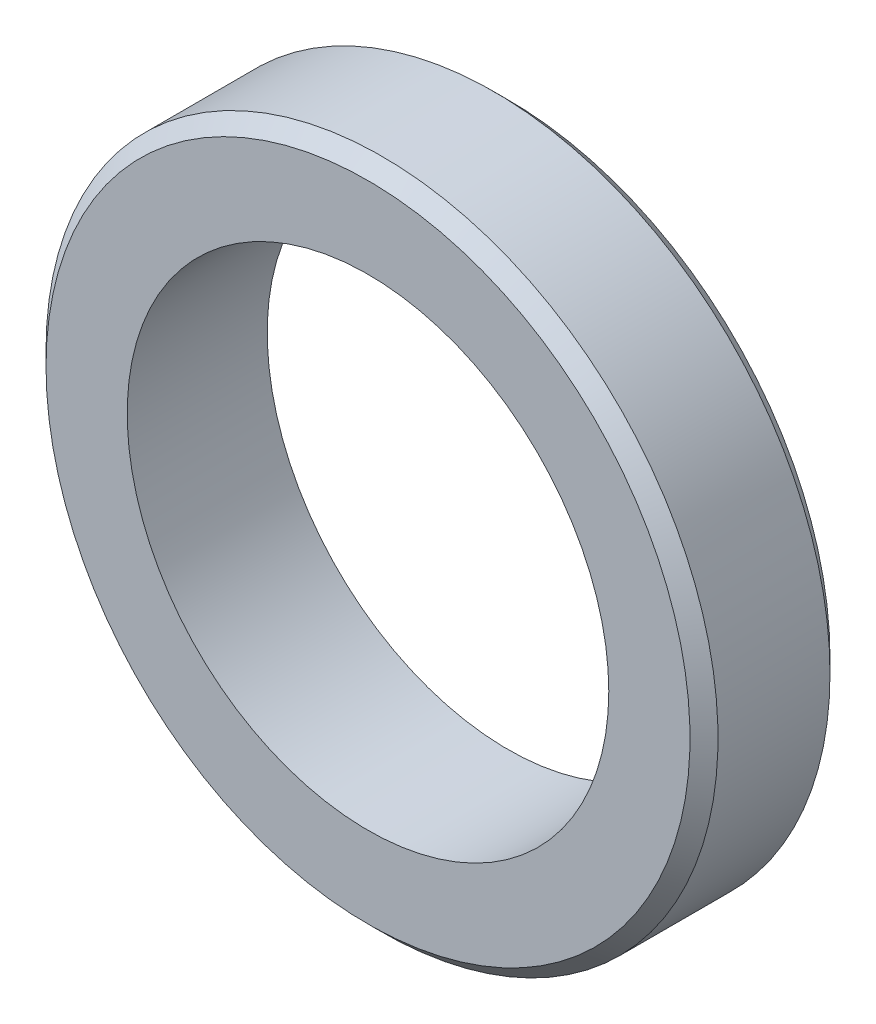
ISO-10303-21;
HEADER;
FILE_DESCRIPTION(('STEP AP214'),'2;1');
FILE_NAME('part.step','',(''),(''),'','','');
FILE_SCHEMA(('AUTOMOTIVE_DESIGN { 1 0 10303 214 1 1 1 1 }'));
ENDSEC;
DATA;
#1=APPLICATION_CONTEXT('core data for automotive mechanical design processes');
#2=APPLICATION_PROTOCOL_DEFINITION('international standard','automotive_design',2000,#1);
#3=PRODUCT_CONTEXT('',#1,'mechanical');
#4=PRODUCT('Part','Part','',(#3));
#5=PRODUCT_RELATED_PRODUCT_CATEGORY('part','',(#4));
#6=PRODUCT_DEFINITION_FORMATION('','',#4);
#7=PRODUCT_DEFINITION_CONTEXT('part definition',#1,'design');
#8=PRODUCT_DEFINITION('design','',#6,#7);
#9=PRODUCT_DEFINITION_SHAPE('','',#8);
#10=(LENGTH_UNIT() NAMED_UNIT(*) SI_UNIT(.MILLI.,.METRE.));
#11=(NAMED_UNIT(*) PLANE_ANGLE_UNIT() SI_UNIT($,.RADIAN.));
#12=(NAMED_UNIT(*) SI_UNIT($,.STERADIAN.) SOLID_ANGLE_UNIT());
#13=UNCERTAINTY_MEASURE_WITH_UNIT(LENGTH_MEASURE(1.E-05),#10,'distance_accuracy_value','');
#14=(GEOMETRIC_REPRESENTATION_CONTEXT(3) GLOBAL_UNCERTAINTY_ASSIGNED_CONTEXT((#13)) GLOBAL_UNIT_ASSIGNED_CONTEXT((#10,
#11,#12)) REPRESENTATION_CONTEXT('',''));
#15=CARTESIAN_POINT('',(0.,0.,0.));
#16=DIRECTION('',(0.,0.,1.));
#17=DIRECTION('',(1.,0.,0.));
#18=AXIS2_PLACEMENT_3D('',#15,#16,#17);
#19=CARTESIAN_POINT('',(0.,0.,5.));
#20=DIRECTION('',(0.,0.,-1.));
#21=DIRECTION('',(-1.,0.,0.));
#22=AXIS2_PLACEMENT_3D('',#19,#20,#21);
#23=CYLINDRICAL_SURFACE('',#22,12.);
#24=CARTESIAN_POINT('',(0.,0.,0.5));
#25=DIRECTION('',(0.,0.,1.));
#26=DIRECTION('',(1.,0.,0.));
#27=AXIS2_PLACEMENT_3D('',#24,#25,#26);
#28=CIRCLE('',#27,12.);
#29=CARTESIAN_POINT('',(-12.,0.,0.500000000000001));
#30=VERTEX_POINT('',#29);
#31=EDGE_CURVE('E52',#30,#30,#28,.T.);
#32=CARTESIAN_POINT('',(0.,0.,4.5));
#33=DIRECTION('',(0.,0.,1.));
#34=DIRECTION('',(1.,0.,0.));
#35=AXIS2_PLACEMENT_3D('',#32,#33,#34);
#36=CIRCLE('',#35,12.);
#37=CARTESIAN_POINT('',(-12.,0.,4.5));
#38=VERTEX_POINT('',#37);
#39=EDGE_CURVE('E56',#38,#38,#36,.F.);
#40=CARTESIAN_POINT('',(-12.,0.,0.500000000000001));
#41=CARTESIAN_POINT('',(-12.,0.,0.541666666666668));
#42=CARTESIAN_POINT('',(-12.,0.,0.583333333333335));
#43=CARTESIAN_POINT('',(-12.,0.,0.666666666666668));
#44=CARTESIAN_POINT('',(-12.,0.,0.708333333333335));
#45=CARTESIAN_POINT('',(-12.,0.,0.791666666666668));
#46=CARTESIAN_POINT('',(-12.,0.,0.833333333333334));
#47=CARTESIAN_POINT('',(-12.,0.,0.916666666666668));
#48=CARTESIAN_POINT('',(-12.,0.,0.958333333333334));
#49=CARTESIAN_POINT('',(-12.,0.,1.04166666666667));
#50=CARTESIAN_POINT('',(-12.,0.,1.08333333333333));
#51=CARTESIAN_POINT('',(-12.,0.,1.16666666666667));
#52=CARTESIAN_POINT('',(-12.,0.,1.20833333333333));
#53=CARTESIAN_POINT('',(-12.,0.,1.29166666666667));
#54=CARTESIAN_POINT('',(-12.,0.,1.33333333333333));
#55=CARTESIAN_POINT('',(-12.,0.,1.41666666666667));
#56=CARTESIAN_POINT('',(-12.,0.,1.45833333333333));
#57=CARTESIAN_POINT('',(-12.,0.,1.54166666666667));
#58=CARTESIAN_POINT('',(-12.,0.,1.58333333333333));
#59=CARTESIAN_POINT('',(-12.,0.,1.66666666666667));
#60=CARTESIAN_POINT('',(-12.,0.,1.70833333333333));
#61=CARTESIAN_POINT('',(-12.,0.,1.79166666666667));
#62=CARTESIAN_POINT('',(-12.,0.,1.83333333333333));
#63=CARTESIAN_POINT('',(-12.,0.,1.91666666666667));
#64=CARTESIAN_POINT('',(-12.,0.,1.95833333333333));
#65=CARTESIAN_POINT('',(-12.,0.,2.04166666666667));
#66=CARTESIAN_POINT('',(-12.,0.,2.08333333333333));
#67=CARTESIAN_POINT('',(-12.,0.,2.16666666666667));
#68=CARTESIAN_POINT('',(-12.,0.,2.20833333333333));
#69=CARTESIAN_POINT('',(-12.,0.,2.29166666666667));
#70=CARTESIAN_POINT('',(-12.,0.,2.33333333333333));
#71=CARTESIAN_POINT('',(-12.,0.,2.41666666666667));
#72=CARTESIAN_POINT('',(-12.,0.,2.45833333333333));
#73=CARTESIAN_POINT('',(-12.,0.,2.54166666666667));
#74=CARTESIAN_POINT('',(-12.,0.,2.58333333333333));
#75=CARTESIAN_POINT('',(-12.,0.,2.66666666666667));
#76=CARTESIAN_POINT('',(-12.,0.,2.70833333333333));
#77=CARTESIAN_POINT('',(-12.,0.,2.79166666666667));
#78=CARTESIAN_POINT('',(-12.,0.,2.83333333333333));
#79=CARTESIAN_POINT('',(-12.,0.,2.91666666666667));
#80=CARTESIAN_POINT('',(-12.,0.,2.95833333333333));
#81=CARTESIAN_POINT('',(-12.,0.,3.04166666666667));
#82=CARTESIAN_POINT('',(-12.,0.,3.08333333333333));
#83=CARTESIAN_POINT('',(-12.,0.,3.16666666666667));
#84=CARTESIAN_POINT('',(-12.,0.,3.20833333333333));
#85=CARTESIAN_POINT('',(-12.,0.,3.29166666666667));
#86=CARTESIAN_POINT('',(-12.,0.,3.33333333333333));
#87=CARTESIAN_POINT('',(-12.,0.,3.41666666666667));
#88=CARTESIAN_POINT('',(-12.,0.,3.45833333333333));
#89=CARTESIAN_POINT('',(-12.,0.,3.54166666666666));
#90=CARTESIAN_POINT('',(-12.,0.,3.58333333333333));
#91=CARTESIAN_POINT('',(-12.,0.,3.66666666666666));
#92=CARTESIAN_POINT('',(-12.,0.,3.70833333333333));
#93=CARTESIAN_POINT('',(-12.,0.,3.79166666666666));
#94=CARTESIAN_POINT('',(-12.,0.,3.83333333333333));
#95=CARTESIAN_POINT('',(-12.,0.,3.91666666666666));
#96=CARTESIAN_POINT('',(-12.,0.,3.95833333333333));
#97=CARTESIAN_POINT('',(-12.,0.,4.04166666666666));
#98=CARTESIAN_POINT('',(-12.,0.,4.08333333333333));
#99=CARTESIAN_POINT('',(-12.,0.,4.16666666666666));
#100=CARTESIAN_POINT('',(-12.,0.,4.20833333333333));
#101=CARTESIAN_POINT('',(-12.,0.,4.29166666666666));
#102=CARTESIAN_POINT('',(-12.,0.,4.33333333333333));
#103=CARTESIAN_POINT('',(-12.,0.,4.41666666666666));
#104=CARTESIAN_POINT('',(-12.,0.,4.45833333333333));
#105=CARTESIAN_POINT('',(-12.,0.,4.5));
#106=B_SPLINE_CURVE_WITH_KNOTS('',3,(#40,#41,#42,#43,#44,#45,#46,#47,#48,#49,#50,#51,#52,#53,
#54,#55,#56,#57,#58,#59,#60,#61,#62,#63,#64,#65,#66,#67,#68,#69,#70,#71,#72,#73,#74,#75,#76,#77,
#78,#79,#80,#81,#82,#83,#84,#85,#86,#87,#88,#89,#90,#91,#92,#93,#94,#95,#96,#97,#98,#99,#100,
#101,#102,#103,#104,#105),.UNSPECIFIED.,.F.,.F.,(4,2,2,2,2,2,2,2,2,2,2,2,2,2,2,2,2,2,2,2,2,2,2,
2,2,2,2,2,2,2,2,2,4),(0.,0.125,0.25,0.374999999999999,0.5,0.625,0.749999999999999,
0.874999999999999,0.999999999999999,1.125,1.25,1.375,1.5,1.625,1.75,1.875,2.,2.125,2.25,2.375,
2.5,2.625,2.75,2.875,3.,3.125,3.25,3.375,3.5,3.625,3.75,3.875,4.),.UNSPECIFIED.);
#107=EDGE_CURVE('BSEAM45',#30,#38,#106,.T.);
#108=ORIENTED_EDGE('',*,*,#31,.T.);
#109=ORIENTED_EDGE('',*,*,#39,.T.);
#110=ORIENTED_EDGE('',*,*,#107,.T.);
#111=ORIENTED_EDGE('',*,*,#107,.F.);
#112=EDGE_LOOP('',(#108,#110,#109,#111));
#113=FACE_BOUND('',#112,.T.);
#114=ADVANCED_FACE('F45',(#113),#23,.T.);
#115=CARTESIAN_POINT('',(0.,0.,5.));
#116=DIRECTION('',(0.,0.,1.));
#117=DIRECTION('',(1.,0.,0.));
#118=AXIS2_PLACEMENT_3D('',#115,#116,#117);
#119=PLANE('',#118);
#120=CARTESIAN_POINT('',(0.,0.,5.));
#121=DIRECTION('',(0.,0.,1.));
#122=DIRECTION('',(1.,0.,0.));
#123=AXIS2_PLACEMENT_3D('',#120,#121,#122);
#124=CIRCLE('',#123,11.5);
#125=CARTESIAN_POINT('',(-11.5,0.,5.));
#126=VERTEX_POINT('',#125);
#127=EDGE_CURVE('E60',#126,#126,#124,.T.);
#128=ORIENTED_EDGE('',*,*,#127,.T.);
#129=EDGE_LOOP('',(#128));
#130=FACE_BOUND('',#129,.T.);
#131=CARTESIAN_POINT('',(0.,0.,5.));
#132=DIRECTION('',(0.,0.,1.));
#133=DIRECTION('',(1.,0.,0.));
#134=AXIS2_PLACEMENT_3D('',#131,#132,#133);
#135=CIRCLE('',#134,8.6);
#136=CARTESIAN_POINT('',(8.6,0.,5.));
#137=VERTEX_POINT('',#136);
#138=EDGE_CURVE('E66',#137,#137,#135,.T.);
#139=ORIENTED_EDGE('',*,*,#138,.F.);
#140=EDGE_LOOP('',(#139));
#141=FACE_BOUND('',#140,.T.);
#142=ADVANCED_FACE('F81',(#130,#141),#119,.T.);
#143=CARTESIAN_POINT('',(0.,0.,0.));
#144=DIRECTION('',(0.,0.,1.));
#145=DIRECTION('',(1.,0.,0.));
#146=AXIS2_PLACEMENT_3D('',#143,#144,#145);
#147=PLANE('',#146);
#148=CARTESIAN_POINT('',(0.,0.,0.));
#149=DIRECTION('',(0.,0.,1.));
#150=DIRECTION('',(1.,0.,0.));
#151=AXIS2_PLACEMENT_3D('',#148,#149,#150);
#152=CIRCLE('',#151,11.5);
#153=CARTESIAN_POINT('',(11.5,0.,0.));
#154=VERTEX_POINT('',#153);
#155=EDGE_CURVE('E12',#154,#154,#152,.F.);
#156=ORIENTED_EDGE('',*,*,#155,.T.);
#157=EDGE_LOOP('',(#156));
#158=FACE_BOUND('',#157,.T.);
#159=CARTESIAN_POINT('',(0.,0.,0.));
#160=DIRECTION('',(0.,0.,1.));
#161=DIRECTION('',(1.,0.,0.));
#162=AXIS2_PLACEMENT_3D('',#159,#160,#161);
#163=CIRCLE('',#162,8.6);
#164=CARTESIAN_POINT('',(8.6,0.,0.));
#165=VERTEX_POINT('',#164);
#166=EDGE_CURVE('E65',#165,#165,#163,.T.);
#167=ORIENTED_EDGE('',*,*,#166,.T.);
#168=EDGE_LOOP('',(#167));
#169=FACE_BOUND('',#168,.T.);
#170=ADVANCED_FACE('F72',(#158,#169),#147,.F.);
#171=CARTESIAN_POINT('',(0.,0.,0.));
#172=DIRECTION('',(0.,0.,1.));
#173=DIRECTION('',(1.,0.,0.));
#174=AXIS2_PLACEMENT_3D('',#171,#172,#173);
#175=CYLINDRICAL_SURFACE('',#174,8.6);
#176=CARTESIAN_POINT('',(8.6,0.,0.));
#177=CARTESIAN_POINT('',(8.6,0.,0.0520833333333334));
#178=CARTESIAN_POINT('',(8.6,0.,0.104166666666667));
#179=CARTESIAN_POINT('',(8.6,0.,0.208333333333333));
#180=CARTESIAN_POINT('',(8.6,0.,0.260416666666667));
#181=CARTESIAN_POINT('',(8.6,0.,0.364583333333333));
#182=CARTESIAN_POINT('',(8.6,0.,0.416666666666667));
#183=CARTESIAN_POINT('',(8.6,0.,0.520833333333333));
#184=CARTESIAN_POINT('',(8.6,0.,0.572916666666667));
#185=CARTESIAN_POINT('',(8.6,0.,0.677083333333333));
#186=CARTESIAN_POINT('',(8.6,0.,0.729166666666667));
#187=CARTESIAN_POINT('',(8.6,0.,0.833333333333333));
#188=CARTESIAN_POINT('',(8.6,0.,0.885416666666667));
#189=CARTESIAN_POINT('',(8.6,0.,0.989583333333333));
#190=CARTESIAN_POINT('',(8.6,0.,1.04166666666667));
#191=CARTESIAN_POINT('',(8.6,0.,1.14583333333333));
#192=CARTESIAN_POINT('',(8.6,0.,1.19791666666667));
#193=CARTESIAN_POINT('',(8.6,0.,1.30208333333333));
#194=CARTESIAN_POINT('',(8.6,0.,1.35416666666667));
#195=CARTESIAN_POINT('',(8.6,0.,1.45833333333333));
#196=CARTESIAN_POINT('',(8.6,0.,1.51041666666667));
#197=CARTESIAN_POINT('',(8.6,0.,1.61458333333333));
#198=CARTESIAN_POINT('',(8.6,0.,1.66666666666667));
#199=CARTESIAN_POINT('',(8.6,0.,1.77083333333333));
#200=CARTESIAN_POINT('',(8.6,0.,1.82291666666667));
#201=CARTESIAN_POINT('',(8.6,0.,1.92708333333333));
#202=CARTESIAN_POINT('',(8.6,0.,1.97916666666667));
#203=CARTESIAN_POINT('',(8.6,0.,2.08333333333333));
#204=CARTESIAN_POINT('',(8.6,0.,2.13541666666667));
#205=CARTESIAN_POINT('',(8.6,0.,2.23958333333333));
#206=CARTESIAN_POINT('',(8.6,0.,2.29166666666667));
#207=CARTESIAN_POINT('',(8.6,0.,2.39583333333333));
#208=CARTESIAN_POINT('',(8.6,0.,2.44791666666667));
#209=CARTESIAN_POINT('',(8.6,0.,2.55208333333333));
#210=CARTESIAN_POINT('',(8.6,0.,2.60416666666667));
#211=CARTESIAN_POINT('',(8.6,0.,2.70833333333333));
#212=CARTESIAN_POINT('',(8.6,0.,2.76041666666667));
#213=CARTESIAN_POINT('',(8.6,0.,2.86458333333333));
#214=CARTESIAN_POINT('',(8.6,0.,2.91666666666667));
#215=CARTESIAN_POINT('',(8.6,0.,3.02083333333333));
#216=CARTESIAN_POINT('',(8.6,0.,3.07291666666667));
#217=CARTESIAN_POINT('',(8.6,0.,3.17708333333333));
#218=CARTESIAN_POINT('',(8.6,0.,3.22916666666667));
#219=CARTESIAN_POINT('',(8.6,0.,3.33333333333333));
#220=CARTESIAN_POINT('',(8.6,0.,3.38541666666667));
#221=CARTESIAN_POINT('',(8.6,0.,3.48958333333333));
#222=CARTESIAN_POINT('',(8.6,0.,3.54166666666667));
#223=CARTESIAN_POINT('',(8.6,0.,3.64583333333333));
#224=CARTESIAN_POINT('',(8.6,0.,3.69791666666667));
#225=CARTESIAN_POINT('',(8.6,0.,3.80208333333333));
#226=CARTESIAN_POINT('',(8.6,0.,3.85416666666667));
#227=CARTESIAN_POINT('',(8.6,0.,3.95833333333333));
#228=CARTESIAN_POINT('',(8.6,0.,4.01041666666667));
#229=CARTESIAN_POINT('',(8.6,0.,4.11458333333333));
#230=CARTESIAN_POINT('',(8.6,0.,4.16666666666667));
#231=CARTESIAN_POINT('',(8.6,0.,4.27083333333333));
#232=CARTESIAN_POINT('',(8.6,0.,4.32291666666667));
#233=CARTESIAN_POINT('',(8.6,0.,4.42708333333333));
#234=CARTESIAN_POINT('',(8.6,0.,4.47916666666667));
#235=CARTESIAN_POINT('',(8.6,0.,4.58333333333333));
#236=CARTESIAN_POINT('',(8.6,0.,4.63541666666667));
#237=CARTESIAN_POINT('',(8.6,0.,4.73958333333333));
#238=CARTESIAN_POINT('',(8.6,0.,4.79166666666667));
#239=CARTESIAN_POINT('',(8.6,0.,4.89583333333333));
#240=CARTESIAN_POINT('',(8.6,0.,4.94791666666667));
#241=CARTESIAN_POINT('',(8.6,0.,5.));
#242=B_SPLINE_CURVE_WITH_KNOTS('',3,(#176,#177,#178,#179,#180,#181,#182,#183,#184,#185,#186,
#187,#188,#189,#190,#191,#192,#193,#194,#195,#196,#197,#198,#199,#200,#201,#202,#203,#204,#205,
#206,#207,#208,#209,#210,#211,#212,#213,#214,#215,#216,#217,#218,#219,#220,#221,#222,#223,#224,
#225,#226,#227,#228,#229,#230,#231,#232,#233,#234,#235,#236,#237,#238,#239,#240,#241),
.UNSPECIFIED.,.F.,.F.,(4,2,2,2,2,2,2,2,2,2,2,2,2,2,2,2,2,2,2,2,2,2,2,2,2,2,2,2,2,2,2,2,4),(0.,
0.15625,0.3125,0.46875,0.625,0.78125,0.9375,1.09375,1.25,1.40625,1.5625,1.71875,1.875,2.03125,
2.1875,2.34375,2.5,2.65625,2.8125,2.96875,3.125,3.28125,3.4375,3.59375,3.75,3.90625,4.0625,
4.21875,4.375,4.53125,4.6875,4.84375,5.),.UNSPECIFIED.);
#243=EDGE_CURVE('BSEAM74',#165,#137,#242,.T.);
#244=ORIENTED_EDGE('',*,*,#166,.F.);
#245=ORIENTED_EDGE('',*,*,#138,.T.);
#246=ORIENTED_EDGE('',*,*,#243,.T.);
#247=ORIENTED_EDGE('',*,*,#243,.F.);
#248=EDGE_LOOP('',(#244,#246,#245,#247));
#249=FACE_BOUND('',#248,.T.);
#250=ADVANCED_FACE('F74',(#249),#175,.F.);
#251=CARTESIAN_POINT('',(0.,0.,5.));
#252=DIRECTION('',(0.,0.,-1.));
#253=DIRECTION('',(-1.,0.,0.));
#254=AXIS2_PLACEMENT_3D('',#251,#252,#253);
#255=CONICAL_SURFACE('',#254,11.5,0.785398163397447);
#256=CARTESIAN_POINT('',(-12.,0.,4.5));
#257=CARTESIAN_POINT('',(-11.9947916666667,0.,4.50520833333333));
#258=CARTESIAN_POINT('',(-11.9895833333333,0.,4.51041666666666));
#259=CARTESIAN_POINT('',(-11.9791666666667,0.,4.52083333333333));
#260=CARTESIAN_POINT('',(-11.9739583333333,0.,4.52604166666666));
#261=CARTESIAN_POINT('',(-11.9635416666667,0.,4.53645833333333));
#262=CARTESIAN_POINT('',(-11.9583333333333,0.,4.54166666666666));
#263=CARTESIAN_POINT('',(-11.9479166666667,0.,4.55208333333333));
#264=CARTESIAN_POINT('',(-11.9427083333333,0.,4.55729166666666));
#265=CARTESIAN_POINT('',(-11.9322916666667,0.,4.56770833333333));
#266=CARTESIAN_POINT('',(-11.9270833333333,0.,4.57291666666666));
#267=CARTESIAN_POINT('',(-11.9166666666667,0.,4.58333333333333));
#268=CARTESIAN_POINT('',(-11.9114583333333,0.,4.58854166666666));
#269=CARTESIAN_POINT('',(-11.9010416666667,0.,4.59895833333333));
#270=CARTESIAN_POINT('',(-11.8958333333333,0.,4.60416666666666));
#271=CARTESIAN_POINT('',(-11.8854166666667,0.,4.61458333333333));
#272=CARTESIAN_POINT('',(-11.8802083333333,0.,4.61979166666666));
#273=CARTESIAN_POINT('',(-11.8697916666667,0.,4.63020833333333));
#274=CARTESIAN_POINT('',(-11.8645833333333,0.,4.63541666666666));
#275=CARTESIAN_POINT('',(-11.8541666666667,0.,4.64583333333333));
#276=CARTESIAN_POINT('',(-11.8489583333333,0.,4.65104166666667));
#277=CARTESIAN_POINT('',(-11.8385416666667,0.,4.66145833333333));
#278=CARTESIAN_POINT('',(-11.8333333333333,0.,4.66666666666667));
#279=CARTESIAN_POINT('',(-11.8229166666667,0.,4.67708333333333));
#280=CARTESIAN_POINT('',(-11.8177083333333,0.,4.68229166666667));
#281=CARTESIAN_POINT('',(-11.8072916666667,0.,4.69270833333333));
#282=CARTESIAN_POINT('',(-11.8020833333333,0.,4.69791666666667));
#283=CARTESIAN_POINT('',(-11.7916666666667,0.,4.70833333333333));
#284=CARTESIAN_POINT('',(-11.7864583333333,0.,4.71354166666667));
#285=CARTESIAN_POINT('',(-11.7760416666667,0.,4.72395833333333));
#286=CARTESIAN_POINT('',(-11.7708333333333,0.,4.72916666666667));
#287=CARTESIAN_POINT('',(-11.7604166666667,0.,4.73958333333333));
#288=CARTESIAN_POINT('',(-11.7552083333333,0.,4.74479166666667));
#289=CARTESIAN_POINT('',(-11.7447916666667,0.,4.75520833333333));
#290=CARTESIAN_POINT('',(-11.7395833333333,0.,4.76041666666667));
#291=CARTESIAN_POINT('',(-11.7291666666667,0.,4.77083333333333));
#292=CARTESIAN_POINT('',(-11.7239583333333,0.,4.77604166666667));
#293=CARTESIAN_POINT('',(-11.7135416666667,0.,4.78645833333333));
#294=CARTESIAN_POINT('',(-11.7083333333333,0.,4.79166666666667));
#295=CARTESIAN_POINT('',(-11.6979166666667,0.,4.80208333333333));
#296=CARTESIAN_POINT('',(-11.6927083333333,0.,4.80729166666667));
#297=CARTESIAN_POINT('',(-11.6822916666667,0.,4.81770833333333));
#298=CARTESIAN_POINT('',(-11.6770833333333,0.,4.82291666666667));
#299=CARTESIAN_POINT('',(-11.6666666666667,0.,4.83333333333333));
#300=CARTESIAN_POINT('',(-11.6614583333333,0.,4.83854166666667));
#301=CARTESIAN_POINT('',(-11.6510416666667,0.,4.84895833333333));
#302=CARTESIAN_POINT('',(-11.6458333333333,0.,4.85416666666667));
#303=CARTESIAN_POINT('',(-11.6354166666667,0.,4.86458333333333));
#304=CARTESIAN_POINT('',(-11.6302083333333,0.,4.86979166666667));
#305=CARTESIAN_POINT('',(-11.6197916666667,0.,4.88020833333333));
#306=CARTESIAN_POINT('',(-11.6145833333333,0.,4.88541666666667));
#307=CARTESIAN_POINT('',(-11.6041666666667,0.,4.89583333333333));
#308=CARTESIAN_POINT('',(-11.5989583333333,0.,4.90104166666667));
#309=CARTESIAN_POINT('',(-11.5885416666667,0.,4.91145833333333));
#310=CARTESIAN_POINT('',(-11.5833333333333,0.,4.91666666666667));
#311=CARTESIAN_POINT('',(-11.5729166666667,0.,4.92708333333333));
#312=CARTESIAN_POINT('',(-11.5677083333333,0.,4.93229166666667));
#313=CARTESIAN_POINT('',(-11.5572916666667,0.,4.94270833333333));
#314=CARTESIAN_POINT('',(-11.5520833333333,0.,4.94791666666667));
#315=CARTESIAN_POINT('',(-11.5416666666667,0.,4.95833333333333));
#316=CARTESIAN_POINT('',(-11.5364583333333,0.,4.96354166666667));
#317=CARTESIAN_POINT('',(-11.5260416666667,0.,4.97395833333333));
#318=CARTESIAN_POINT('',(-11.5208333333333,0.,4.97916666666667));
#319=CARTESIAN_POINT('',(-11.5104166666667,0.,4.98958333333333));
#320=CARTESIAN_POINT('',(-11.5052083333333,0.,4.99479166666667));
#321=CARTESIAN_POINT('',(-11.5,0.,5.));
#322=B_SPLINE_CURVE_WITH_KNOTS('',3,(#256,#257,#258,#259,#260,#261,#262,#263,#264,#265,#266,
#267,#268,#269,#270,#271,#272,#273,#274,#275,#276,#277,#278,#279,#280,#281,#282,#283,#284,#285,
#286,#287,#288,#289,#290,#291,#292,#293,#294,#295,#296,#297,#298,#299,#300,#301,#302,#303,#304,
#305,#306,#307,#308,#309,#310,#311,#312,#313,#314,#315,#316,#317,#318,#319,#320,#321),
.UNSPECIFIED.,.F.,.F.,(4,2,2,2,2,2,2,2,2,2,2,2,2,2,2,2,2,2,2,2,2,2,2,2,2,2,2,2,2,2,2,2,4),(0.,
0.0220970869120796,0.0441941738241593,0.0662912607362389,0.0883883476483185,0.110485434560398,
0.132582521472478,0.154679608384557,0.176776695296637,0.198873782208717,0.220970869120797,
0.243067956032877,0.265165042944956,0.287262129857036,0.309359216769115,0.331456303681195,
0.353553390593276,0.375650477505356,0.397747564417435,0.419844651329515,0.441941738241595,
0.464038825153675,0.486135912065754,0.508232998977834,0.530330085889914,0.552427172801993,
0.574524259714073,0.596621346626153,0.618718433538232,0.640815520450312,0.662912607362391,
0.685009694274471,0.707106781186551),.UNSPECIFIED.);
#323=EDGE_CURVE('BSEAM77',#38,#126,#322,.T.);
#324=ORIENTED_EDGE('',*,*,#39,.F.);
#325=ORIENTED_EDGE('',*,*,#127,.F.);
#326=ORIENTED_EDGE('',*,*,#323,.T.);
#327=ORIENTED_EDGE('',*,*,#323,.F.);
#328=EDGE_LOOP('',(#324,#326,#325,#327));
#329=FACE_BOUND('',#328,.T.);
#330=ADVANCED_FACE('F77',(#329),#255,.T.);
#331=CARTESIAN_POINT('',(0.,0.,0.5));
#332=DIRECTION('',(0.,0.,1.));
#333=DIRECTION('',(1.,0.,0.));
#334=AXIS2_PLACEMENT_3D('',#331,#332,#333);
#335=CONICAL_SURFACE('',#334,12.,0.78539816339745);
#336=ORIENTED_EDGE('',*,*,#155,.F.);
#337=EDGE_LOOP('',(#336));
#338=FACE_BOUND('',#337,.T.);
#339=ORIENTED_EDGE('',*,*,#31,.F.);
#340=EDGE_LOOP('',(#339));
#341=FACE_BOUND('',#340,.T.);
#342=ADVANCED_FACE('F47',(#338,#341),#335,.T.);
#343=CLOSED_SHELL('',(#114,#142,#170,#250,#330,#342));
#344=MANIFOLD_SOLID_BREP('B2',#343);
#345=ADVANCED_BREP_SHAPE_REPRESENTATION('',(#18,#344),#14);
#346=SHAPE_DEFINITION_REPRESENTATION(#9,#345);
ENDSEC;
END-ISO-10303-21;
